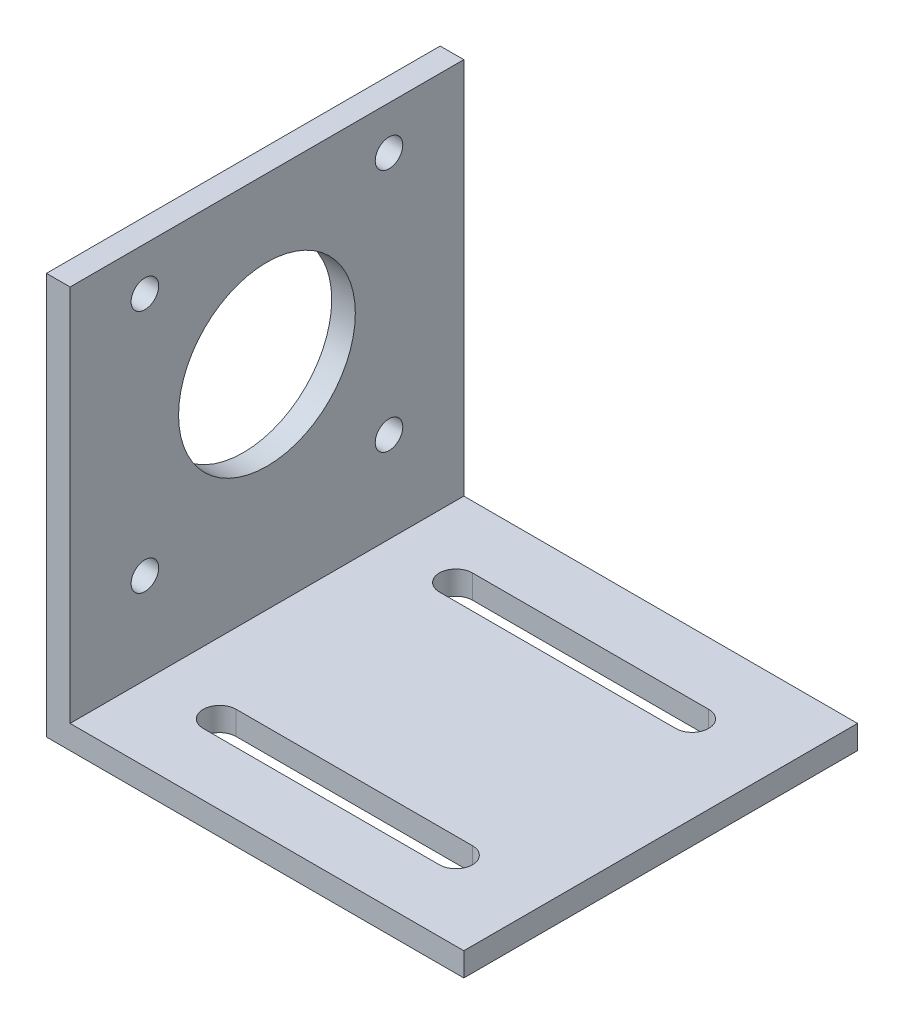
ISO-10303-21;
HEADER;
FILE_DESCRIPTION(('STEP AP214'),'2;1');
FILE_NAME('part.step','',(''),(''),'','','');
FILE_SCHEMA(('AUTOMOTIVE_DESIGN { 1 0 10303 214 1 1 1 1 }'));
ENDSEC;
DATA;
#1=APPLICATION_CONTEXT('core data for automotive mechanical design processes');
#2=APPLICATION_PROTOCOL_DEFINITION('international standard','automotive_design',2000,#1);
#3=PRODUCT_CONTEXT('',#1,'mechanical');
#4=PRODUCT('Part','Part','',(#3));
#5=PRODUCT_RELATED_PRODUCT_CATEGORY('part','',(#4));
#6=PRODUCT_DEFINITION_FORMATION('','',#4);
#7=PRODUCT_DEFINITION_CONTEXT('part definition',#1,'design');
#8=PRODUCT_DEFINITION('design','',#6,#7);
#9=PRODUCT_DEFINITION_SHAPE('','',#8);
#10=(LENGTH_UNIT() NAMED_UNIT(*) SI_UNIT(.MILLI.,.METRE.));
#11=(NAMED_UNIT(*) PLANE_ANGLE_UNIT() SI_UNIT($,.RADIAN.));
#12=(NAMED_UNIT(*) SI_UNIT($,.STERADIAN.) SOLID_ANGLE_UNIT());
#13=UNCERTAINTY_MEASURE_WITH_UNIT(LENGTH_MEASURE(1.E-05),#10,'distance_accuracy_value','');
#14=(GEOMETRIC_REPRESENTATION_CONTEXT(3) GLOBAL_UNCERTAINTY_ASSIGNED_CONTEXT((#13)) GLOBAL_UNIT_ASSIGNED_CONTEXT((#10,
#11,#12)) REPRESENTATION_CONTEXT('',''));
#15=CARTESIAN_POINT('',(0.,0.,0.));
#16=DIRECTION('',(0.,0.,1.));
#17=DIRECTION('',(1.,0.,0.));
#18=AXIS2_PLACEMENT_3D('',#15,#16,#17);
#19=CARTESIAN_POINT('',(26.5,-22.5,50.));
#20=DIRECTION('',(-1.,0.,0.));
#21=DIRECTION('',(0.,-1.,0.));
#22=AXIS2_PLACEMENT_3D('',#19,#20,#21);
#23=PLANE('',#22);
#24=DIRECTION('',(0.,1.,0.));
#25=VECTOR('',#24,1.);
#26=CARTESIAN_POINT('',(26.5,-22.5,0.));
#27=LINE('',#26,#25);
#28=CARTESIAN_POINT('',(26.5,-25.5,0.));
#29=VERTEX_POINT('',#28);
#30=CARTESIAN_POINT('',(26.5,-22.5,0.));
#31=VERTEX_POINT('',#30);
#32=EDGE_CURVE('E230',#29,#31,#27,.T.);
#33=ORIENTED_EDGE('',*,*,#32,.T.);
#34=DIRECTION('',(0.,0.,-1.));
#35=VECTOR('',#34,1.);
#36=CARTESIAN_POINT('',(26.5,-22.5,50.));
#37=LINE('',#36,#35);
#38=CARTESIAN_POINT('',(26.5,-22.5,50.));
#39=VERTEX_POINT('',#38);
#40=EDGE_CURVE('E11',#39,#31,#37,.T.);
#41=ORIENTED_EDGE('',*,*,#40,.F.);
#42=DIRECTION('',(0.,1.,0.));
#43=VECTOR('',#42,1.);
#44=CARTESIAN_POINT('',(26.5,-22.5,50.));
#45=LINE('',#44,#43);
#46=CARTESIAN_POINT('',(26.5,-25.5,50.));
#47=VERTEX_POINT('',#46);
#48=EDGE_CURVE('E233',#47,#39,#45,.T.);
#49=ORIENTED_EDGE('',*,*,#48,.F.);
#50=DIRECTION('',(0.,0.,-1.));
#51=VECTOR('',#50,1.);
#52=CARTESIAN_POINT('',(26.5,-25.5,50.));
#53=LINE('',#52,#51);
#54=EDGE_CURVE('E247',#47,#29,#53,.T.);
#55=ORIENTED_EDGE('',*,*,#54,.T.);
#56=EDGE_LOOP('',(#33,#41,#49,#55));
#57=FACE_BOUND('',#56,.T.);
#58=ADVANCED_FACE('F34',(#57),#23,.F.);
#59=CARTESIAN_POINT('',(-23.5,-22.5,50.));
#60=DIRECTION('',(0.,-1.,0.));
#61=DIRECTION('',(1.,0.,0.));
#62=AXIS2_PLACEMENT_3D('',#59,#60,#61);
#63=PLANE('',#62);
#64=DIRECTION('',(-1.,0.,0.));
#65=VECTOR('',#64,1.);
#66=CARTESIAN_POINT('',(15.5,-22.5,37.9));
#67=LINE('',#66,#65);
#68=CARTESIAN_POINT('',(15.5,-22.5,37.9));
#69=VERTEX_POINT('',#68);
#70=CARTESIAN_POINT('',(-14.5,-22.5,37.9));
#71=VERTEX_POINT('',#70);
#72=EDGE_CURVE('E161',#69,#71,#67,.T.);
#73=ORIENTED_EDGE('',*,*,#72,.F.);
#74=CARTESIAN_POINT('',(15.5,-22.5,40.));
#75=DIRECTION('',(0.,1.,0.));
#76=DIRECTION('',(-1.,0.,0.));
#77=AXIS2_PLACEMENT_3D('',#74,#75,#76);
#78=CIRCLE('',#77,2.1);
#79=CARTESIAN_POINT('',(15.5,-22.5,42.1));
#80=VERTEX_POINT('',#79);
#81=EDGE_CURVE('E48',#80,#69,#78,.T.);
#82=ORIENTED_EDGE('',*,*,#81,.F.);
#83=DIRECTION('',(1.,0.,0.));
#84=VECTOR('',#83,1.);
#85=CARTESIAN_POINT('',(-14.5,-22.5,42.1));
#86=LINE('',#85,#84);
#87=CARTESIAN_POINT('',(-14.5,-22.5,42.1));
#88=VERTEX_POINT('',#87);
#89=EDGE_CURVE('E152',#88,#80,#86,.T.);
#90=ORIENTED_EDGE('',*,*,#89,.F.);
#91=CARTESIAN_POINT('',(-14.5,-22.5,40.));
#92=DIRECTION('',(0.,1.,0.));
#93=DIRECTION('',(-1.,0.,0.));
#94=AXIS2_PLACEMENT_3D('',#91,#92,#93);
#95=CIRCLE('',#94,2.1);
#96=EDGE_CURVE('E155',#71,#88,#95,.T.);
#97=ORIENTED_EDGE('',*,*,#96,.F.);
#98=EDGE_LOOP('',(#73,#82,#90,#97));
#99=FACE_BOUND('',#98,.T.);
#100=DIRECTION('',(1.,0.,0.));
#101=VECTOR('',#100,1.);
#102=CARTESIAN_POINT('',(15.5,-22.5,12.1));
#103=LINE('',#102,#101);
#104=CARTESIAN_POINT('',(-14.5,-22.5,12.1));
#105=VERTEX_POINT('',#104);
#106=CARTESIAN_POINT('',(15.5,-22.5,12.1));
#107=VERTEX_POINT('',#106);
#108=EDGE_CURVE('E186',#105,#107,#103,.T.);
#109=ORIENTED_EDGE('',*,*,#108,.F.);
#110=CARTESIAN_POINT('',(-14.5,-22.5,10.));
#111=DIRECTION('',(0.,1.,0.));
#112=DIRECTION('',(-1.,0.,0.));
#113=AXIS2_PLACEMENT_3D('',#110,#111,#112);
#114=CIRCLE('',#113,2.1);
#115=CARTESIAN_POINT('',(-14.5,-22.5,7.9));
#116=VERTEX_POINT('',#115);
#117=EDGE_CURVE('E167',#116,#105,#114,.T.);
#118=ORIENTED_EDGE('',*,*,#117,.F.);
#119=DIRECTION('',(-1.,0.,0.));
#120=VECTOR('',#119,1.);
#121=CARTESIAN_POINT('',(-14.5,-22.5,7.9));
#122=LINE('',#121,#120);
#123=CARTESIAN_POINT('',(15.5,-22.5,7.9));
#124=VERTEX_POINT('',#123);
#125=EDGE_CURVE('E175',#124,#116,#122,.T.);
#126=ORIENTED_EDGE('',*,*,#125,.F.);
#127=CARTESIAN_POINT('',(15.5,-22.5,10.));
#128=DIRECTION('',(0.,1.,0.));
#129=DIRECTION('',(-1.,0.,0.));
#130=AXIS2_PLACEMENT_3D('',#127,#128,#129);
#131=CIRCLE('',#130,2.1);
#132=EDGE_CURVE('E189',#107,#124,#131,.T.);
#133=ORIENTED_EDGE('',*,*,#132,.F.);
#134=EDGE_LOOP('',(#109,#118,#126,#133));
#135=FACE_BOUND('',#134,.T.);
#136=DIRECTION('',(-1.,0.,0.));
#137=VECTOR('',#136,1.);
#138=CARTESIAN_POINT('',(-23.5,-22.5,0.));
#139=LINE('',#138,#137);
#140=CARTESIAN_POINT('',(-23.5,-22.5,0.));
#141=VERTEX_POINT('',#140);
#142=EDGE_CURVE('E250',#31,#141,#139,.T.);
#143=ORIENTED_EDGE('',*,*,#142,.T.);
#144=DIRECTION('',(0.,0.,-1.));
#145=VECTOR('',#144,1.);
#146=CARTESIAN_POINT('',(-23.5,-22.5,50.));
#147=LINE('',#146,#145);
#148=CARTESIAN_POINT('',(-23.5,-22.5,50.));
#149=VERTEX_POINT('',#148);
#150=EDGE_CURVE('E41',#149,#141,#147,.T.);
#151=ORIENTED_EDGE('',*,*,#150,.F.);
#152=DIRECTION('',(-1.,0.,0.));
#153=VECTOR('',#152,1.);
#154=CARTESIAN_POINT('',(-23.5,-22.5,50.));
#155=LINE('',#154,#153);
#156=EDGE_CURVE('E236',#39,#149,#155,.T.);
#157=ORIENTED_EDGE('',*,*,#156,.F.);
#158=ORIENTED_EDGE('',*,*,#40,.T.);
#159=EDGE_LOOP('',(#143,#151,#157,#158));
#160=FACE_BOUND('',#159,.T.);
#161=ADVANCED_FACE('F297',(#99,#135,#160),#63,.F.);
#162=CARTESIAN_POINT('',(-23.5,25.5,50.));
#163=DIRECTION('',(-1.,0.,0.));
#164=DIRECTION('',(0.,-1.,0.));
#165=AXIS2_PLACEMENT_3D('',#162,#163,#164);
#166=PLANE('',#165);
#167=CARTESIAN_POINT('',(-23.5,-11.,40.4999999999999));
#168=DIRECTION('',(1.,0.,0.));
#169=DIRECTION('',(0.,1.,0.));
#170=AXIS2_PLACEMENT_3D('',#167,#168,#169);
#171=CIRCLE('',#170,1.75);
#172=CARTESIAN_POINT('',(-23.5,-9.24999999999999,40.4999999999999));
#173=VERTEX_POINT('',#172);
#174=EDGE_CURVE('E196',#173,#173,#171,.T.);
#175=ORIENTED_EDGE('',*,*,#174,.F.);
#176=EDGE_LOOP('',(#175));
#177=FACE_BOUND('',#176,.T.);
#178=CARTESIAN_POINT('',(-23.5,-11.,9.49999999999995));
#179=DIRECTION('',(1.,0.,0.));
#180=DIRECTION('',(0.,1.,0.));
#181=AXIS2_PLACEMENT_3D('',#178,#179,#180);
#182=CIRCLE('',#181,1.75);
#183=CARTESIAN_POINT('',(-23.5,-9.24999999999999,9.49999999999995));
#184=VERTEX_POINT('',#183);
#185=EDGE_CURVE('E206',#184,#184,#182,.T.);
#186=ORIENTED_EDGE('',*,*,#185,.F.);
#187=EDGE_LOOP('',(#186));
#188=FACE_BOUND('',#187,.T.);
#189=CARTESIAN_POINT('',(-23.5,20.,9.49999999999995));
#190=DIRECTION('',(1.,0.,0.));
#191=DIRECTION('',(0.,1.,0.));
#192=AXIS2_PLACEMENT_3D('',#189,#190,#191);
#193=CIRCLE('',#192,1.75);
#194=CARTESIAN_POINT('',(-23.5,21.75,9.49999999999995));
#195=VERTEX_POINT('',#194);
#196=EDGE_CURVE('E212',#195,#195,#193,.T.);
#197=ORIENTED_EDGE('',*,*,#196,.F.);
#198=EDGE_LOOP('',(#197));
#199=FACE_BOUND('',#198,.T.);
#200=CARTESIAN_POINT('',(-23.5,20.,40.4999999999999));
#201=DIRECTION('',(1.,0.,0.));
#202=DIRECTION('',(0.,1.,0.));
#203=AXIS2_PLACEMENT_3D('',#200,#201,#202);
#204=CIRCLE('',#203,1.75);
#205=CARTESIAN_POINT('',(-23.5,21.75,40.4999999999999));
#206=VERTEX_POINT('',#205);
#207=EDGE_CURVE('E218',#206,#206,#204,.T.);
#208=ORIENTED_EDGE('',*,*,#207,.F.);
#209=EDGE_LOOP('',(#208));
#210=FACE_BOUND('',#209,.T.);
#211=CARTESIAN_POINT('',(-23.5,4.49999999999999,25.));
#212=DIRECTION('',(1.,0.,0.));
#213=DIRECTION('',(0.,1.,0.));
#214=AXIS2_PLACEMENT_3D('',#211,#212,#213);
#215=CIRCLE('',#214,11.2232575209576);
#216=CARTESIAN_POINT('',(-23.5,15.7232575209576,25.));
#217=VERTEX_POINT('',#216);
#218=EDGE_CURVE('E224',#217,#217,#215,.T.);
#219=ORIENTED_EDGE('',*,*,#218,.F.);
#220=EDGE_LOOP('',(#219));
#221=FACE_BOUND('',#220,.T.);
#222=DIRECTION('',(0.,1.,0.));
#223=VECTOR('',#222,1.);
#224=CARTESIAN_POINT('',(-23.5,25.5,0.));
#225=LINE('',#224,#223);
#226=CARTESIAN_POINT('',(-23.5,25.5,0.));
#227=VERTEX_POINT('',#226);
#228=EDGE_CURVE('E252',#141,#227,#225,.T.);
#229=ORIENTED_EDGE('',*,*,#228,.T.);
#230=DIRECTION('',(0.,0.,-1.));
#231=VECTOR('',#230,1.);
#232=CARTESIAN_POINT('',(-23.5,25.5,50.));
#233=LINE('',#232,#231);
#234=CARTESIAN_POINT('',(-23.5,25.5,50.));
#235=VERTEX_POINT('',#234);
#236=EDGE_CURVE('E267',#235,#227,#233,.T.);
#237=ORIENTED_EDGE('',*,*,#236,.F.);
#238=DIRECTION('',(0.,1.,0.));
#239=VECTOR('',#238,1.);
#240=CARTESIAN_POINT('',(-23.5,25.5,50.));
#241=LINE('',#240,#239);
#242=EDGE_CURVE('E239',#149,#235,#241,.T.);
#243=ORIENTED_EDGE('',*,*,#242,.F.);
#244=ORIENTED_EDGE('',*,*,#150,.T.);
#245=EDGE_LOOP('',(#229,#237,#243,#244));
#246=FACE_BOUND('',#245,.T.);
#247=ADVANCED_FACE('F274',(#177,#188,#199,#210,#221,#246),#166,.F.);
#248=CARTESIAN_POINT('',(-26.5,25.5,50.));
#249=DIRECTION('',(0.,-1.,0.));
#250=DIRECTION('',(0.,0.,-1.));
#251=AXIS2_PLACEMENT_3D('',#248,#249,#250);
#252=PLANE('',#251);
#253=DIRECTION('',(-1.,0.,0.));
#254=VECTOR('',#253,1.);
#255=CARTESIAN_POINT('',(-26.5,25.5,0.));
#256=LINE('',#255,#254);
#257=CARTESIAN_POINT('',(-26.5,25.5,0.));
#258=VERTEX_POINT('',#257);
#259=EDGE_CURVE('E254',#227,#258,#256,.T.);
#260=ORIENTED_EDGE('',*,*,#259,.T.);
#261=DIRECTION('',(0.,0.,-1.));
#262=VECTOR('',#261,1.);
#263=CARTESIAN_POINT('',(-26.5,25.5,50.));
#264=LINE('',#263,#262);
#265=CARTESIAN_POINT('',(-26.5,25.5,50.));
#266=VERTEX_POINT('',#265);
#267=EDGE_CURVE('E264',#266,#258,#264,.T.);
#268=ORIENTED_EDGE('',*,*,#267,.F.);
#269=DIRECTION('',(-1.,0.,0.));
#270=VECTOR('',#269,1.);
#271=CARTESIAN_POINT('',(-26.5,25.5,50.));
#272=LINE('',#271,#270);
#273=EDGE_CURVE('E241',#235,#266,#272,.T.);
#274=ORIENTED_EDGE('',*,*,#273,.F.);
#275=ORIENTED_EDGE('',*,*,#236,.T.);
#276=EDGE_LOOP('',(#260,#268,#274,#275));
#277=FACE_BOUND('',#276,.T.);
#278=ADVANCED_FACE('F285',(#277),#252,.F.);
#279=CARTESIAN_POINT('',(-26.5,25.5,50.));
#280=DIRECTION('',(1.,0.,0.));
#281=DIRECTION('',(0.,1.,0.));
#282=AXIS2_PLACEMENT_3D('',#279,#280,#281);
#283=PLANE('',#282);
#284=CARTESIAN_POINT('',(-26.5,-11.,40.4999999999999));
#285=DIRECTION('',(1.,0.,0.));
#286=DIRECTION('',(0.,1.,0.));
#287=AXIS2_PLACEMENT_3D('',#284,#285,#286);
#288=CIRCLE('',#287,1.75);
#289=CARTESIAN_POINT('',(-26.5,-9.24999999999999,40.4999999999999));
#290=VERTEX_POINT('',#289);
#291=EDGE_CURVE('E203',#290,#290,#288,.T.);
#292=ORIENTED_EDGE('',*,*,#291,.T.);
#293=EDGE_LOOP('',(#292));
#294=FACE_BOUND('',#293,.T.);
#295=CARTESIAN_POINT('',(-26.5,-11.,9.49999999999995));
#296=DIRECTION('',(1.,0.,0.));
#297=DIRECTION('',(0.,1.,0.));
#298=AXIS2_PLACEMENT_3D('',#295,#296,#297);
#299=CIRCLE('',#298,1.75);
#300=CARTESIAN_POINT('',(-26.5,-9.24999999999999,9.49999999999995));
#301=VERTEX_POINT('',#300);
#302=EDGE_CURVE('E209',#301,#301,#299,.T.);
#303=ORIENTED_EDGE('',*,*,#302,.T.);
#304=EDGE_LOOP('',(#303));
#305=FACE_BOUND('',#304,.T.);
#306=CARTESIAN_POINT('',(-26.5,20.,9.49999999999995));
#307=DIRECTION('',(1.,0.,0.));
#308=DIRECTION('',(0.,1.,0.));
#309=AXIS2_PLACEMENT_3D('',#306,#307,#308);
#310=CIRCLE('',#309,1.75);
#311=CARTESIAN_POINT('',(-26.5,21.75,9.49999999999995));
#312=VERTEX_POINT('',#311);
#313=EDGE_CURVE('E215',#312,#312,#310,.T.);
#314=ORIENTED_EDGE('',*,*,#313,.T.);
#315=EDGE_LOOP('',(#314));
#316=FACE_BOUND('',#315,.T.);
#317=CARTESIAN_POINT('',(-26.5,20.,40.4999999999999));
#318=DIRECTION('',(1.,0.,0.));
#319=DIRECTION('',(0.,1.,0.));
#320=AXIS2_PLACEMENT_3D('',#317,#318,#319);
#321=CIRCLE('',#320,1.75);
#322=CARTESIAN_POINT('',(-26.5,21.75,40.4999999999999));
#323=VERTEX_POINT('',#322);
#324=EDGE_CURVE('E221',#323,#323,#321,.T.);
#325=ORIENTED_EDGE('',*,*,#324,.T.);
#326=EDGE_LOOP('',(#325));
#327=FACE_BOUND('',#326,.T.);
#328=CARTESIAN_POINT('',(-26.5,4.49999999999999,25.));
#329=DIRECTION('',(1.,0.,0.));
#330=DIRECTION('',(0.,1.,0.));
#331=AXIS2_PLACEMENT_3D('',#328,#329,#330);
#332=CIRCLE('',#331,11.2232575209576);
#333=CARTESIAN_POINT('',(-26.5,15.7232575209576,25.));
#334=VERTEX_POINT('',#333);
#335=EDGE_CURVE('E227',#334,#334,#332,.T.);
#336=ORIENTED_EDGE('',*,*,#335,.T.);
#337=EDGE_LOOP('',(#336));
#338=FACE_BOUND('',#337,.T.);
#339=DIRECTION('',(0.,-1.,0.));
#340=VECTOR('',#339,1.);
#341=CARTESIAN_POINT('',(-26.5,25.5,0.));
#342=LINE('',#341,#340);
#343=CARTESIAN_POINT('',(-26.5,-25.5,0.));
#344=VERTEX_POINT('',#343);
#345=EDGE_CURVE('E256',#258,#344,#342,.T.);
#346=ORIENTED_EDGE('',*,*,#345,.T.);
#347=DIRECTION('',(0.,0.,-1.));
#348=VECTOR('',#347,1.);
#349=CARTESIAN_POINT('',(-26.5,-25.5,50.));
#350=LINE('',#349,#348);
#351=CARTESIAN_POINT('',(-26.5,-25.5,50.));
#352=VERTEX_POINT('',#351);
#353=EDGE_CURVE('E261',#352,#344,#350,.T.);
#354=ORIENTED_EDGE('',*,*,#353,.F.);
#355=DIRECTION('',(0.,-1.,0.));
#356=VECTOR('',#355,1.);
#357=CARTESIAN_POINT('',(-26.5,25.5,50.));
#358=LINE('',#357,#356);
#359=EDGE_CURVE('E243',#266,#352,#358,.T.);
#360=ORIENTED_EDGE('',*,*,#359,.F.);
#361=ORIENTED_EDGE('',*,*,#267,.T.);
#362=EDGE_LOOP('',(#346,#354,#360,#361));
#363=FACE_BOUND('',#362,.T.);
#364=ADVANCED_FACE('F289',(#294,#305,#316,#327,#338,#363),#283,.F.);
#365=CARTESIAN_POINT('',(-26.5,-25.5,50.));
#366=DIRECTION('',(0.,1.,0.));
#367=DIRECTION('',(0.,0.,1.));
#368=AXIS2_PLACEMENT_3D('',#365,#366,#367);
#369=PLANE('',#368);
#370=DIRECTION('',(1.,0.,0.));
#371=VECTOR('',#370,1.);
#372=CARTESIAN_POINT('',(-14.5,-25.5,42.1));
#373=LINE('',#372,#371);
#374=CARTESIAN_POINT('',(-14.5,-25.5,42.1));
#375=VERTEX_POINT('',#374);
#376=CARTESIAN_POINT('',(15.5,-25.5,42.1));
#377=VERTEX_POINT('',#376);
#378=EDGE_CURVE('E142',#375,#377,#373,.T.);
#379=ORIENTED_EDGE('',*,*,#378,.T.);
#380=CARTESIAN_POINT('',(15.5,-25.5,40.));
#381=DIRECTION('',(0.,1.,0.));
#382=DIRECTION('',(-1.,0.,0.));
#383=AXIS2_PLACEMENT_3D('',#380,#381,#382);
#384=CIRCLE('',#383,2.1);
#385=CARTESIAN_POINT('',(15.5,-25.5,37.9));
#386=VERTEX_POINT('',#385);
#387=EDGE_CURVE('E136',#377,#386,#384,.T.);
#388=ORIENTED_EDGE('',*,*,#387,.T.);
#389=DIRECTION('',(-1.,0.,0.));
#390=VECTOR('',#389,1.);
#391=CARTESIAN_POINT('',(15.5,-25.5,37.9));
#392=LINE('',#391,#390);
#393=CARTESIAN_POINT('',(-14.5,-25.5,37.9));
#394=VERTEX_POINT('',#393);
#395=EDGE_CURVE('E145',#386,#394,#392,.T.);
#396=ORIENTED_EDGE('',*,*,#395,.T.);
#397=CARTESIAN_POINT('',(-14.5,-25.5,40.));
#398=DIRECTION('',(0.,1.,0.));
#399=DIRECTION('',(-1.,0.,0.));
#400=AXIS2_PLACEMENT_3D('',#397,#398,#399);
#401=CIRCLE('',#400,2.1);
#402=EDGE_CURVE('E56',#394,#375,#401,.T.);
#403=ORIENTED_EDGE('',*,*,#402,.T.);
#404=EDGE_LOOP('',(#379,#388,#396,#403));
#405=FACE_BOUND('',#404,.T.);
#406=DIRECTION('',(-1.,0.,0.));
#407=VECTOR('',#406,1.);
#408=CARTESIAN_POINT('',(-14.5,-25.5,7.9));
#409=LINE('',#408,#407);
#410=CARTESIAN_POINT('',(15.5,-25.5,7.9));
#411=VERTEX_POINT('',#410);
#412=CARTESIAN_POINT('',(-14.5,-25.5,7.9));
#413=VERTEX_POINT('',#412);
#414=EDGE_CURVE('E181',#411,#413,#409,.T.);
#415=ORIENTED_EDGE('',*,*,#414,.T.);
#416=CARTESIAN_POINT('',(-14.5,-25.5,10.));
#417=DIRECTION('',(0.,1.,0.));
#418=DIRECTION('',(-1.,0.,0.));
#419=AXIS2_PLACEMENT_3D('',#416,#417,#418);
#420=CIRCLE('',#419,2.1);
#421=CARTESIAN_POINT('',(-14.5,-25.5,12.1));
#422=VERTEX_POINT('',#421);
#423=EDGE_CURVE('E171',#413,#422,#420,.T.);
#424=ORIENTED_EDGE('',*,*,#423,.T.);
#425=DIRECTION('',(1.,0.,0.));
#426=VECTOR('',#425,1.);
#427=CARTESIAN_POINT('',(15.5,-25.5,12.1));
#428=LINE('',#427,#426);
#429=CARTESIAN_POINT('',(15.5,-25.5,12.1));
#430=VERTEX_POINT('',#429);
#431=EDGE_CURVE('E174',#422,#430,#428,.T.);
#432=ORIENTED_EDGE('',*,*,#431,.T.);
#433=CARTESIAN_POINT('',(15.5,-25.5,10.));
#434=DIRECTION('',(0.,1.,0.));
#435=DIRECTION('',(-1.,0.,0.));
#436=AXIS2_PLACEMENT_3D('',#433,#434,#435);
#437=CIRCLE('',#436,2.1);
#438=EDGE_CURVE('E178',#430,#411,#437,.T.);
#439=ORIENTED_EDGE('',*,*,#438,.T.);
#440=EDGE_LOOP('',(#415,#424,#432,#439));
#441=FACE_BOUND('',#440,.T.);
#442=DIRECTION('',(1.,0.,0.));
#443=VECTOR('',#442,1.);
#444=CARTESIAN_POINT('',(-26.5,-25.5,0.));
#445=LINE('',#444,#443);
#446=EDGE_CURVE('E237',#344,#29,#445,.T.);
#447=ORIENTED_EDGE('',*,*,#446,.T.);
#448=ORIENTED_EDGE('',*,*,#54,.F.);
#449=DIRECTION('',(1.,0.,0.));
#450=VECTOR('',#449,1.);
#451=CARTESIAN_POINT('',(-26.5,-25.5,50.));
#452=LINE('',#451,#450);
#453=EDGE_CURVE('E245',#352,#47,#452,.T.);
#454=ORIENTED_EDGE('',*,*,#453,.F.);
#455=ORIENTED_EDGE('',*,*,#353,.T.);
#456=EDGE_LOOP('',(#447,#448,#454,#455));
#457=FACE_BOUND('',#456,.T.);
#458=ADVANCED_FACE('F149',(#405,#441,#457),#369,.F.);
#459=CARTESIAN_POINT('',(0.,0.,50.));
#460=DIRECTION('',(0.,0.,1.));
#461=DIRECTION('',(1.,0.,0.));
#462=AXIS2_PLACEMENT_3D('',#459,#460,#461);
#463=PLANE('',#462);
#464=ORIENTED_EDGE('',*,*,#48,.T.);
#465=ORIENTED_EDGE('',*,*,#156,.T.);
#466=ORIENTED_EDGE('',*,*,#242,.T.);
#467=ORIENTED_EDGE('',*,*,#273,.T.);
#468=ORIENTED_EDGE('',*,*,#359,.T.);
#469=ORIENTED_EDGE('',*,*,#453,.T.);
#470=EDGE_LOOP('',(#464,#465,#466,#467,#468,#469));
#471=FACE_BOUND('',#470,.T.);
#472=ADVANCED_FACE('F293',(#471),#463,.T.);
#473=CARTESIAN_POINT('',(0.,0.,0.));
#474=DIRECTION('',(0.,0.,1.));
#475=DIRECTION('',(1.,0.,0.));
#476=AXIS2_PLACEMENT_3D('',#473,#474,#475);
#477=PLANE('',#476);
#478=ORIENTED_EDGE('',*,*,#32,.F.);
#479=ORIENTED_EDGE('',*,*,#446,.F.);
#480=ORIENTED_EDGE('',*,*,#345,.F.);
#481=ORIENTED_EDGE('',*,*,#259,.F.);
#482=ORIENTED_EDGE('',*,*,#228,.F.);
#483=ORIENTED_EDGE('',*,*,#142,.F.);
#484=EDGE_LOOP('',(#478,#479,#480,#481,#482,#483));
#485=FACE_BOUND('',#484,.T.);
#486=ADVANCED_FACE('F280',(#485),#477,.F.);
#487=CARTESIAN_POINT('',(-26.5,4.49999999999999,25.));
#488=DIRECTION('',(1.,0.,0.));
#489=DIRECTION('',(0.,1.,0.));
#490=AXIS2_PLACEMENT_3D('',#487,#488,#489);
#491=CYLINDRICAL_SURFACE('',#490,11.2232575209576);
#492=ORIENTED_EDGE('',*,*,#335,.F.);
#493=EDGE_LOOP('',(#492));
#494=FACE_BOUND('',#493,.T.);
#495=ORIENTED_EDGE('',*,*,#218,.T.);
#496=EDGE_LOOP('',(#495));
#497=FACE_BOUND('',#496,.T.);
#498=ADVANCED_FACE('F341',(#494,#497),#491,.F.);
#499=CARTESIAN_POINT('',(-26.5,20.,40.4999999999999));
#500=DIRECTION('',(1.,0.,0.));
#501=DIRECTION('',(0.,1.,0.));
#502=AXIS2_PLACEMENT_3D('',#499,#500,#501);
#503=CYLINDRICAL_SURFACE('',#502,1.75);
#504=ORIENTED_EDGE('',*,*,#324,.F.);
#505=EDGE_LOOP('',(#504));
#506=FACE_BOUND('',#505,.T.);
#507=ORIENTED_EDGE('',*,*,#207,.T.);
#508=EDGE_LOOP('',(#507));
#509=FACE_BOUND('',#508,.T.);
#510=ADVANCED_FACE('F346',(#506,#509),#503,.F.);
#511=CARTESIAN_POINT('',(-26.5,20.,9.49999999999995));
#512=DIRECTION('',(1.,0.,0.));
#513=DIRECTION('',(0.,1.,0.));
#514=AXIS2_PLACEMENT_3D('',#511,#512,#513);
#515=CYLINDRICAL_SURFACE('',#514,1.75);
#516=ORIENTED_EDGE('',*,*,#313,.F.);
#517=EDGE_LOOP('',(#516));
#518=FACE_BOUND('',#517,.T.);
#519=ORIENTED_EDGE('',*,*,#196,.T.);
#520=EDGE_LOOP('',(#519));
#521=FACE_BOUND('',#520,.T.);
#522=ADVANCED_FACE('F358',(#518,#521),#515,.F.);
#523=CARTESIAN_POINT('',(-26.5,-11.,9.49999999999995));
#524=DIRECTION('',(1.,0.,0.));
#525=DIRECTION('',(0.,1.,0.));
#526=AXIS2_PLACEMENT_3D('',#523,#524,#525);
#527=CYLINDRICAL_SURFACE('',#526,1.75);
#528=ORIENTED_EDGE('',*,*,#302,.F.);
#529=EDGE_LOOP('',(#528));
#530=FACE_BOUND('',#529,.T.);
#531=ORIENTED_EDGE('',*,*,#185,.T.);
#532=EDGE_LOOP('',(#531));
#533=FACE_BOUND('',#532,.T.);
#534=ADVANCED_FACE('F368',(#530,#533),#527,.F.);
#535=CARTESIAN_POINT('',(-26.5,-11.,40.4999999999999));
#536=DIRECTION('',(1.,0.,0.));
#537=DIRECTION('',(0.,1.,0.));
#538=AXIS2_PLACEMENT_3D('',#535,#536,#537);
#539=CYLINDRICAL_SURFACE('',#538,1.75);
#540=ORIENTED_EDGE('',*,*,#291,.F.);
#541=EDGE_LOOP('',(#540));
#542=FACE_BOUND('',#541,.T.);
#543=ORIENTED_EDGE('',*,*,#174,.T.);
#544=EDGE_LOOP('',(#543));
#545=FACE_BOUND('',#544,.T.);
#546=ADVANCED_FACE('F378',(#542,#545),#539,.F.);
#547=CARTESIAN_POINT('',(-14.5,-25.5,10.));
#548=DIRECTION('',(0.,1.,0.));
#549=DIRECTION('',(-1.,0.,0.));
#550=AXIS2_PLACEMENT_3D('',#547,#548,#549);
#551=CYLINDRICAL_SURFACE('',#550,2.1);
#552=ORIENTED_EDGE('',*,*,#117,.T.);
#553=DIRECTION('',(0.,1.,0.));
#554=VECTOR('',#553,1.);
#555=CARTESIAN_POINT('',(-14.5,-25.5,12.1));
#556=LINE('',#555,#554);
#557=EDGE_CURVE('E184',#422,#105,#556,.T.);
#558=ORIENTED_EDGE('',*,*,#557,.F.);
#559=ORIENTED_EDGE('',*,*,#423,.F.);
#560=DIRECTION('',(0.,1.,0.));
#561=VECTOR('',#560,1.);
#562=CARTESIAN_POINT('',(-14.5,-25.5,7.9));
#563=LINE('',#562,#561);
#564=EDGE_CURVE('E194',#413,#116,#563,.T.);
#565=ORIENTED_EDGE('',*,*,#564,.T.);
#566=EDGE_LOOP('',(#552,#558,#559,#565));
#567=FACE_BOUND('',#566,.T.);
#568=ADVANCED_FACE('F387',(#567),#551,.F.);
#569=CARTESIAN_POINT('',(-14.5,-25.5,7.9));
#570=DIRECTION('',(0.,0.,-1.));
#571=DIRECTION('',(-1.,0.,0.));
#572=AXIS2_PLACEMENT_3D('',#569,#570,#571);
#573=PLANE('',#572);
#574=ORIENTED_EDGE('',*,*,#125,.T.);
#575=ORIENTED_EDGE('',*,*,#564,.F.);
#576=ORIENTED_EDGE('',*,*,#414,.F.);
#577=DIRECTION('',(0.,1.,0.));
#578=VECTOR('',#577,1.);
#579=CARTESIAN_POINT('',(15.5,-25.5,7.9));
#580=LINE('',#579,#578);
#581=EDGE_CURVE('E197',#411,#124,#580,.T.);
#582=ORIENTED_EDGE('',*,*,#581,.T.);
#583=EDGE_LOOP('',(#574,#575,#576,#582));
#584=FACE_BOUND('',#583,.T.);
#585=ADVANCED_FACE('F407',(#584),#573,.F.);
#586=CARTESIAN_POINT('',(15.5,-25.5,10.));
#587=DIRECTION('',(0.,1.,0.));
#588=DIRECTION('',(-1.,0.,0.));
#589=AXIS2_PLACEMENT_3D('',#586,#587,#588);
#590=CYLINDRICAL_SURFACE('',#589,2.1);
#591=ORIENTED_EDGE('',*,*,#132,.T.);
#592=ORIENTED_EDGE('',*,*,#581,.F.);
#593=ORIENTED_EDGE('',*,*,#438,.F.);
#594=DIRECTION('',(0.,1.,0.));
#595=VECTOR('',#594,1.);
#596=CARTESIAN_POINT('',(15.5,-25.5,12.1));
#597=LINE('',#596,#595);
#598=EDGE_CURVE('E199',#430,#107,#597,.T.);
#599=ORIENTED_EDGE('',*,*,#598,.T.);
#600=EDGE_LOOP('',(#591,#592,#593,#599));
#601=FACE_BOUND('',#600,.T.);
#602=ADVANCED_FACE('F417',(#601),#590,.F.);
#603=CARTESIAN_POINT('',(15.5,-25.5,12.1));
#604=DIRECTION('',(0.,0.,1.));
#605=DIRECTION('',(1.,0.,0.));
#606=AXIS2_PLACEMENT_3D('',#603,#604,#605);
#607=PLANE('',#606);
#608=ORIENTED_EDGE('',*,*,#108,.T.);
#609=ORIENTED_EDGE('',*,*,#598,.F.);
#610=ORIENTED_EDGE('',*,*,#431,.F.);
#611=ORIENTED_EDGE('',*,*,#557,.T.);
#612=EDGE_LOOP('',(#608,#609,#610,#611));
#613=FACE_BOUND('',#612,.T.);
#614=ADVANCED_FACE('F427',(#613),#607,.F.);
#615=CARTESIAN_POINT('',(15.5,-25.5,40.));
#616=DIRECTION('',(0.,1.,0.));
#617=DIRECTION('',(-1.,0.,0.));
#618=AXIS2_PLACEMENT_3D('',#615,#616,#617);
#619=CYLINDRICAL_SURFACE('',#618,2.1);
#620=ORIENTED_EDGE('',*,*,#81,.T.);
#621=DIRECTION('',(0.,1.,0.));
#622=VECTOR('',#621,1.);
#623=CARTESIAN_POINT('',(15.5,-25.5,37.9));
#624=LINE('',#623,#622);
#625=EDGE_CURVE('E132',#386,#69,#624,.T.);
#626=ORIENTED_EDGE('',*,*,#625,.F.);
#627=ORIENTED_EDGE('',*,*,#387,.F.);
#628=DIRECTION('',(0.,1.,0.));
#629=VECTOR('',#628,1.);
#630=CARTESIAN_POINT('',(15.5,-25.5,42.1));
#631=LINE('',#630,#629);
#632=EDGE_CURVE('E165',#377,#80,#631,.T.);
#633=ORIENTED_EDGE('',*,*,#632,.T.);
#634=EDGE_LOOP('',(#620,#626,#627,#633));
#635=FACE_BOUND('',#634,.T.);
#636=ADVANCED_FACE('F134',(#635),#619,.F.);
#637=CARTESIAN_POINT('',(-14.5,-25.5,42.1));
#638=DIRECTION('',(0.,0.,1.));
#639=DIRECTION('',(1.,0.,0.));
#640=AXIS2_PLACEMENT_3D('',#637,#638,#639);
#641=PLANE('',#640);
#642=ORIENTED_EDGE('',*,*,#89,.T.);
#643=ORIENTED_EDGE('',*,*,#632,.F.);
#644=ORIENTED_EDGE('',*,*,#378,.F.);
#645=DIRECTION('',(0.,1.,0.));
#646=VECTOR('',#645,1.);
#647=CARTESIAN_POINT('',(-14.5,-25.5,42.1));
#648=LINE('',#647,#646);
#649=EDGE_CURVE('E168',#375,#88,#648,.T.);
#650=ORIENTED_EDGE('',*,*,#649,.T.);
#651=EDGE_LOOP('',(#642,#643,#644,#650));
#652=FACE_BOUND('',#651,.T.);
#653=ADVANCED_FACE('F446',(#652),#641,.F.);
#654=CARTESIAN_POINT('',(-14.5,-25.5,40.));
#655=DIRECTION('',(0.,1.,0.));
#656=DIRECTION('',(-1.,0.,0.));
#657=AXIS2_PLACEMENT_3D('',#654,#655,#656);
#658=CYLINDRICAL_SURFACE('',#657,2.1);
#659=ORIENTED_EDGE('',*,*,#96,.T.);
#660=ORIENTED_EDGE('',*,*,#649,.F.);
#661=ORIENTED_EDGE('',*,*,#402,.F.);
#662=DIRECTION('',(0.,1.,0.));
#663=VECTOR('',#662,1.);
#664=CARTESIAN_POINT('',(-14.5,-25.5,37.9));
#665=LINE('',#664,#663);
#666=EDGE_CURVE('E141',#394,#71,#665,.T.);
#667=ORIENTED_EDGE('',*,*,#666,.T.);
#668=EDGE_LOOP('',(#659,#660,#661,#667));
#669=FACE_BOUND('',#668,.T.);
#670=ADVANCED_FACE('F455',(#669),#658,.F.);
#671=CARTESIAN_POINT('',(15.5,-25.5,37.9));
#672=DIRECTION('',(0.,0.,-1.));
#673=DIRECTION('',(-1.,0.,0.));
#674=AXIS2_PLACEMENT_3D('',#671,#672,#673);
#675=PLANE('',#674);
#676=ORIENTED_EDGE('',*,*,#72,.T.);
#677=ORIENTED_EDGE('',*,*,#666,.F.);
#678=ORIENTED_EDGE('',*,*,#395,.F.);
#679=ORIENTED_EDGE('',*,*,#625,.T.);
#680=EDGE_LOOP('',(#676,#677,#678,#679));
#681=FACE_BOUND('',#680,.T.);
#682=ADVANCED_FACE('F146',(#681),#675,.F.);
#683=CLOSED_SHELL('',(#58,#161,#247,#278,#364,#458,#472,#486,#498,#510,#522,#534,#546,#568,#585,
#602,#614,#636,#653,#670,#682));
#684=MANIFOLD_SOLID_BREP('B2',#683);
#685=ADVANCED_BREP_SHAPE_REPRESENTATION('',(#18,#684),#14);
#686=SHAPE_DEFINITION_REPRESENTATION(#9,#685);
ENDSEC;
END-ISO-10303-21;
